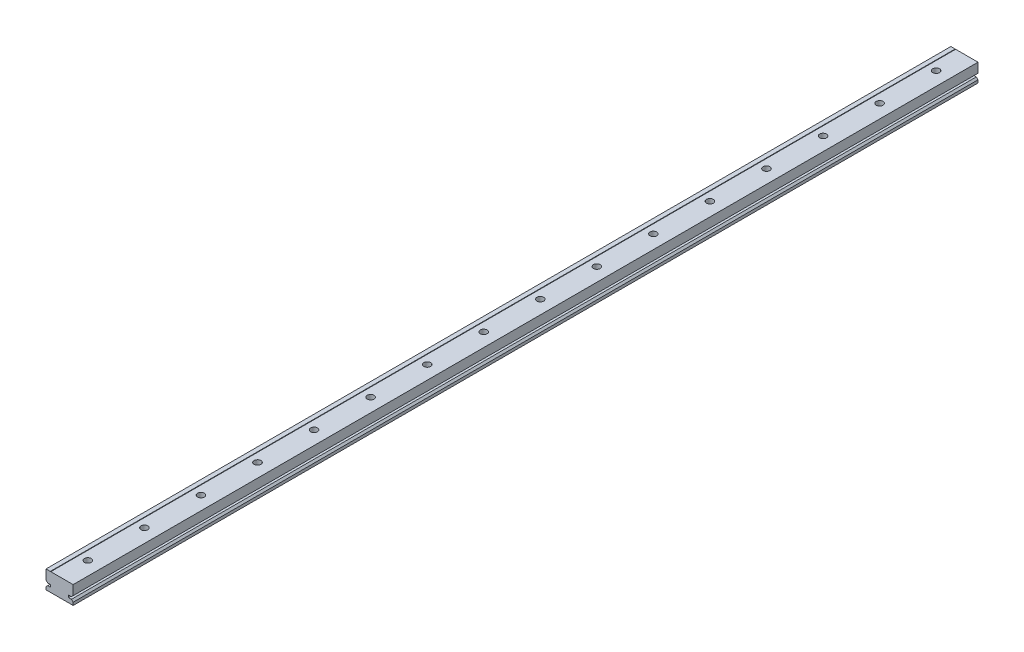
ISO-10303-21;
HEADER;
FILE_DESCRIPTION(('STEP AP214'),'2;1');
FILE_NAME('part.step','',(''),(''),'','','');
FILE_SCHEMA(('AUTOMOTIVE_DESIGN { 1 0 10303 214 1 1 1 1 }'));
ENDSEC;
DATA;
#1=APPLICATION_CONTEXT('core data for automotive mechanical design processes');
#2=APPLICATION_PROTOCOL_DEFINITION('international standard','automotive_design',2000,#1);
#3=PRODUCT_CONTEXT('',#1,'mechanical');
#4=PRODUCT('Part','Part','',(#3));
#5=PRODUCT_RELATED_PRODUCT_CATEGORY('part','',(#4));
#6=PRODUCT_DEFINITION_FORMATION('','',#4);
#7=PRODUCT_DEFINITION_CONTEXT('part definition',#1,'design');
#8=PRODUCT_DEFINITION('design','',#6,#7);
#9=PRODUCT_DEFINITION_SHAPE('','',#8);
#10=(LENGTH_UNIT() NAMED_UNIT(*) SI_UNIT(.MILLI.,.METRE.));
#11=(NAMED_UNIT(*) PLANE_ANGLE_UNIT() SI_UNIT($,.RADIAN.));
#12=(NAMED_UNIT(*) SI_UNIT($,.STERADIAN.) SOLID_ANGLE_UNIT());
#13=UNCERTAINTY_MEASURE_WITH_UNIT(LENGTH_MEASURE(1.E-05),#10,'distance_accuracy_value','');
#14=(GEOMETRIC_REPRESENTATION_CONTEXT(3) GLOBAL_UNCERTAINTY_ASSIGNED_CONTEXT((#13)) GLOBAL_UNIT_ASSIGNED_CONTEXT((#10,
#11,#12)) REPRESENTATION_CONTEXT('',''));
#15=CARTESIAN_POINT('',(0.,0.,0.));
#16=DIRECTION('',(0.,0.,1.));
#17=DIRECTION('',(1.,0.,0.));
#18=AXIS2_PLACEMENT_3D('',#15,#16,#17);
#19=CARTESIAN_POINT('',(0.,6.,387.5));
#20=DIRECTION('',(0.,-1.,0.));
#21=DIRECTION('',(0.,0.,-1.));
#22=AXIS2_PLACEMENT_3D('',#19,#20,#21);
#23=CYLINDRICAL_SURFACE('',#22,1.5);
#24=CARTESIAN_POINT('',(0.,-4.,387.5));
#25=DIRECTION('',(0.,-1.,0.));
#26=DIRECTION('',(0.,0.,-1.));
#27=AXIS2_PLACEMENT_3D('',#24,#25,#26);
#28=CIRCLE('',#27,1.5);
#29=CARTESIAN_POINT('',(0.,-4.,386.));
#30=VERTEX_POINT('',#29);
#31=EDGE_CURVE('E40',#30,#30,#28,.T.);
#32=ORIENTED_EDGE('',*,*,#31,.T.);
#33=EDGE_LOOP('',(#32));
#34=FACE_BOUND('',#33,.T.);
#35=CARTESIAN_POINT('',(0.,4.,387.5));
#36=DIRECTION('',(0.,-1.,0.));
#37=DIRECTION('',(1.,0.,0.));
#38=AXIS2_PLACEMENT_3D('',#35,#36,#37);
#39=CIRCLE('',#38,1.5);
#40=CARTESIAN_POINT('',(1.5,4.,387.5));
#41=VERTEX_POINT('',#40);
#42=EDGE_CURVE('E11',#41,#41,#39,.T.);
#43=ORIENTED_EDGE('',*,*,#42,.F.);
#44=EDGE_LOOP('',(#43));
#45=FACE_BOUND('',#44,.T.);
#46=ADVANCED_FACE('F32',(#34,#45),#23,.F.);
#47=CARTESIAN_POINT('',(0.,6.,362.5));
#48=DIRECTION('',(0.,-1.,0.));
#49=DIRECTION('',(0.,0.,-1.));
#50=AXIS2_PLACEMENT_3D('',#47,#48,#49);
#51=CYLINDRICAL_SURFACE('',#50,1.5);
#52=CARTESIAN_POINT('',(0.,-4.,362.5));
#53=DIRECTION('',(0.,-1.,0.));
#54=DIRECTION('',(0.,0.,-1.));
#55=AXIS2_PLACEMENT_3D('',#52,#53,#54);
#56=CIRCLE('',#55,1.5);
#57=CARTESIAN_POINT('',(0.,-4.,361.));
#58=VERTEX_POINT('',#57);
#59=EDGE_CURVE('E352',#58,#58,#56,.T.);
#60=ORIENTED_EDGE('',*,*,#59,.T.);
#61=EDGE_LOOP('',(#60));
#62=FACE_BOUND('',#61,.T.);
#63=CARTESIAN_POINT('',(0.,4.,362.5));
#64=DIRECTION('',(0.,-1.,0.));
#65=DIRECTION('',(1.,0.,0.));
#66=AXIS2_PLACEMENT_3D('',#63,#64,#65);
#67=CIRCLE('',#66,1.5);
#68=CARTESIAN_POINT('',(1.5,4.,362.5));
#69=VERTEX_POINT('',#68);
#70=EDGE_CURVE('E355',#69,#69,#67,.T.);
#71=ORIENTED_EDGE('',*,*,#70,.F.);
#72=EDGE_LOOP('',(#71));
#73=FACE_BOUND('',#72,.T.);
#74=ADVANCED_FACE('F377',(#62,#73),#51,.F.);
#75=CARTESIAN_POINT('',(0.,6.,337.5));
#76=DIRECTION('',(0.,-1.,0.));
#77=DIRECTION('',(0.,0.,-1.));
#78=AXIS2_PLACEMENT_3D('',#75,#76,#77);
#79=CYLINDRICAL_SURFACE('',#78,1.5);
#80=CARTESIAN_POINT('',(0.,-4.,337.5));
#81=DIRECTION('',(0.,-1.,0.));
#82=DIRECTION('',(0.,0.,-1.));
#83=AXIS2_PLACEMENT_3D('',#80,#81,#82);
#84=CIRCLE('',#83,1.5);
#85=CARTESIAN_POINT('',(0.,-4.,336.));
#86=VERTEX_POINT('',#85);
#87=EDGE_CURVE('E346',#86,#86,#84,.T.);
#88=ORIENTED_EDGE('',*,*,#87,.T.);
#89=EDGE_LOOP('',(#88));
#90=FACE_BOUND('',#89,.T.);
#91=CARTESIAN_POINT('',(0.,4.,337.5));
#92=DIRECTION('',(0.,-1.,0.));
#93=DIRECTION('',(1.,0.,0.));
#94=AXIS2_PLACEMENT_3D('',#91,#92,#93);
#95=CIRCLE('',#94,1.5);
#96=CARTESIAN_POINT('',(1.5,4.,337.5));
#97=VERTEX_POINT('',#96);
#98=EDGE_CURVE('E349',#97,#97,#95,.T.);
#99=ORIENTED_EDGE('',*,*,#98,.F.);
#100=EDGE_LOOP('',(#99));
#101=FACE_BOUND('',#100,.T.);
#102=ADVANCED_FACE('F381',(#90,#101),#79,.F.);
#103=CARTESIAN_POINT('',(0.,6.,312.5));
#104=DIRECTION('',(0.,-1.,0.));
#105=DIRECTION('',(0.,0.,-1.));
#106=AXIS2_PLACEMENT_3D('',#103,#104,#105);
#107=CYLINDRICAL_SURFACE('',#106,1.5);
#108=CARTESIAN_POINT('',(0.,-4.,312.5));
#109=DIRECTION('',(0.,-1.,0.));
#110=DIRECTION('',(0.,0.,-1.));
#111=AXIS2_PLACEMENT_3D('',#108,#109,#110);
#112=CIRCLE('',#111,1.5);
#113=CARTESIAN_POINT('',(0.,-4.,311.));
#114=VERTEX_POINT('',#113);
#115=EDGE_CURVE('E340',#114,#114,#112,.T.);
#116=ORIENTED_EDGE('',*,*,#115,.T.);
#117=EDGE_LOOP('',(#116));
#118=FACE_BOUND('',#117,.T.);
#119=CARTESIAN_POINT('',(0.,4.,312.5));
#120=DIRECTION('',(0.,-1.,0.));
#121=DIRECTION('',(1.,0.,0.));
#122=AXIS2_PLACEMENT_3D('',#119,#120,#121);
#123=CIRCLE('',#122,1.5);
#124=CARTESIAN_POINT('',(1.5,4.,312.5));
#125=VERTEX_POINT('',#124);
#126=EDGE_CURVE('E343',#125,#125,#123,.T.);
#127=ORIENTED_EDGE('',*,*,#126,.F.);
#128=EDGE_LOOP('',(#127));
#129=FACE_BOUND('',#128,.T.);
#130=ADVANCED_FACE('F386',(#118,#129),#107,.F.);
#131=CARTESIAN_POINT('',(0.,6.,287.5));
#132=DIRECTION('',(0.,-1.,0.));
#133=DIRECTION('',(0.,0.,-1.));
#134=AXIS2_PLACEMENT_3D('',#131,#132,#133);
#135=CYLINDRICAL_SURFACE('',#134,1.5);
#136=CARTESIAN_POINT('',(0.,-4.,287.5));
#137=DIRECTION('',(0.,-1.,0.));
#138=DIRECTION('',(0.,0.,-1.));
#139=AXIS2_PLACEMENT_3D('',#136,#137,#138);
#140=CIRCLE('',#139,1.5);
#141=CARTESIAN_POINT('',(0.,-4.,286.));
#142=VERTEX_POINT('',#141);
#143=EDGE_CURVE('E334',#142,#142,#140,.T.);
#144=ORIENTED_EDGE('',*,*,#143,.T.);
#145=EDGE_LOOP('',(#144));
#146=FACE_BOUND('',#145,.T.);
#147=CARTESIAN_POINT('',(0.,4.,287.5));
#148=DIRECTION('',(0.,-1.,0.));
#149=DIRECTION('',(1.,0.,0.));
#150=AXIS2_PLACEMENT_3D('',#147,#148,#149);
#151=CIRCLE('',#150,1.5);
#152=CARTESIAN_POINT('',(1.5,4.,287.5));
#153=VERTEX_POINT('',#152);
#154=EDGE_CURVE('E337',#153,#153,#151,.T.);
#155=ORIENTED_EDGE('',*,*,#154,.F.);
#156=EDGE_LOOP('',(#155));
#157=FACE_BOUND('',#156,.T.);
#158=ADVANCED_FACE('F393',(#146,#157),#135,.F.);
#159=CARTESIAN_POINT('',(0.,6.,262.5));
#160=DIRECTION('',(0.,-1.,0.));
#161=DIRECTION('',(0.,0.,-1.));
#162=AXIS2_PLACEMENT_3D('',#159,#160,#161);
#163=CYLINDRICAL_SURFACE('',#162,1.5);
#164=CARTESIAN_POINT('',(0.,-4.,262.5));
#165=DIRECTION('',(0.,-1.,0.));
#166=DIRECTION('',(0.,0.,-1.));
#167=AXIS2_PLACEMENT_3D('',#164,#165,#166);
#168=CIRCLE('',#167,1.5);
#169=CARTESIAN_POINT('',(0.,-4.,261.));
#170=VERTEX_POINT('',#169);
#171=EDGE_CURVE('E328',#170,#170,#168,.T.);
#172=ORIENTED_EDGE('',*,*,#171,.T.);
#173=EDGE_LOOP('',(#172));
#174=FACE_BOUND('',#173,.T.);
#175=CARTESIAN_POINT('',(0.,4.,262.5));
#176=DIRECTION('',(0.,-1.,0.));
#177=DIRECTION('',(1.,0.,0.));
#178=AXIS2_PLACEMENT_3D('',#175,#176,#177);
#179=CIRCLE('',#178,1.5);
#180=CARTESIAN_POINT('',(1.5,4.,262.5));
#181=VERTEX_POINT('',#180);
#182=EDGE_CURVE('E331',#181,#181,#179,.T.);
#183=ORIENTED_EDGE('',*,*,#182,.F.);
#184=EDGE_LOOP('',(#183));
#185=FACE_BOUND('',#184,.T.);
#186=ADVANCED_FACE('F397',(#174,#185),#163,.F.);
#187=CARTESIAN_POINT('',(0.,6.,237.5));
#188=DIRECTION('',(0.,-1.,0.));
#189=DIRECTION('',(0.,0.,-1.));
#190=AXIS2_PLACEMENT_3D('',#187,#188,#189);
#191=CYLINDRICAL_SURFACE('',#190,1.5);
#192=CARTESIAN_POINT('',(0.,-4.,237.5));
#193=DIRECTION('',(0.,-1.,0.));
#194=DIRECTION('',(0.,0.,-1.));
#195=AXIS2_PLACEMENT_3D('',#192,#193,#194);
#196=CIRCLE('',#195,1.5);
#197=CARTESIAN_POINT('',(0.,-4.,236.));
#198=VERTEX_POINT('',#197);
#199=EDGE_CURVE('E322',#198,#198,#196,.T.);
#200=ORIENTED_EDGE('',*,*,#199,.T.);
#201=EDGE_LOOP('',(#200));
#202=FACE_BOUND('',#201,.T.);
#203=CARTESIAN_POINT('',(0.,4.,237.5));
#204=DIRECTION('',(0.,-1.,0.));
#205=DIRECTION('',(1.,0.,0.));
#206=AXIS2_PLACEMENT_3D('',#203,#204,#205);
#207=CIRCLE('',#206,1.5);
#208=CARTESIAN_POINT('',(1.5,4.,237.5));
#209=VERTEX_POINT('',#208);
#210=EDGE_CURVE('E325',#209,#209,#207,.T.);
#211=ORIENTED_EDGE('',*,*,#210,.F.);
#212=EDGE_LOOP('',(#211));
#213=FACE_BOUND('',#212,.T.);
#214=ADVANCED_FACE('F401',(#202,#213),#191,.F.);
#215=CARTESIAN_POINT('',(0.,6.,212.5));
#216=DIRECTION('',(0.,-1.,0.));
#217=DIRECTION('',(0.,0.,-1.));
#218=AXIS2_PLACEMENT_3D('',#215,#216,#217);
#219=CYLINDRICAL_SURFACE('',#218,1.5);
#220=CARTESIAN_POINT('',(0.,-4.,212.5));
#221=DIRECTION('',(0.,-1.,0.));
#222=DIRECTION('',(0.,0.,-1.));
#223=AXIS2_PLACEMENT_3D('',#220,#221,#222);
#224=CIRCLE('',#223,1.5);
#225=CARTESIAN_POINT('',(0.,-4.,211.));
#226=VERTEX_POINT('',#225);
#227=EDGE_CURVE('E316',#226,#226,#224,.T.);
#228=ORIENTED_EDGE('',*,*,#227,.T.);
#229=EDGE_LOOP('',(#228));
#230=FACE_BOUND('',#229,.T.);
#231=CARTESIAN_POINT('',(0.,4.,212.5));
#232=DIRECTION('',(0.,-1.,0.));
#233=DIRECTION('',(1.,0.,0.));
#234=AXIS2_PLACEMENT_3D('',#231,#232,#233);
#235=CIRCLE('',#234,1.5);
#236=CARTESIAN_POINT('',(1.5,4.,212.5));
#237=VERTEX_POINT('',#236);
#238=EDGE_CURVE('E319',#237,#237,#235,.T.);
#239=ORIENTED_EDGE('',*,*,#238,.F.);
#240=EDGE_LOOP('',(#239));
#241=FACE_BOUND('',#240,.T.);
#242=ADVANCED_FACE('F405',(#230,#241),#219,.F.);
#243=CARTESIAN_POINT('',(0.,6.,187.5));
#244=DIRECTION('',(0.,-1.,0.));
#245=DIRECTION('',(0.,0.,-1.));
#246=AXIS2_PLACEMENT_3D('',#243,#244,#245);
#247=CYLINDRICAL_SURFACE('',#246,1.5);
#248=CARTESIAN_POINT('',(0.,-4.,187.5));
#249=DIRECTION('',(0.,-1.,0.));
#250=DIRECTION('',(0.,0.,-1.));
#251=AXIS2_PLACEMENT_3D('',#248,#249,#250);
#252=CIRCLE('',#251,1.5);
#253=CARTESIAN_POINT('',(0.,-4.,186.));
#254=VERTEX_POINT('',#253);
#255=EDGE_CURVE('E310',#254,#254,#252,.T.);
#256=ORIENTED_EDGE('',*,*,#255,.T.);
#257=EDGE_LOOP('',(#256));
#258=FACE_BOUND('',#257,.T.);
#259=CARTESIAN_POINT('',(0.,4.,187.5));
#260=DIRECTION('',(0.,-1.,0.));
#261=DIRECTION('',(1.,0.,0.));
#262=AXIS2_PLACEMENT_3D('',#259,#260,#261);
#263=CIRCLE('',#262,1.5);
#264=CARTESIAN_POINT('',(1.5,4.,187.5));
#265=VERTEX_POINT('',#264);
#266=EDGE_CURVE('E313',#265,#265,#263,.T.);
#267=ORIENTED_EDGE('',*,*,#266,.F.);
#268=EDGE_LOOP('',(#267));
#269=FACE_BOUND('',#268,.T.);
#270=ADVANCED_FACE('F409',(#258,#269),#247,.F.);
#271=CARTESIAN_POINT('',(0.,6.,162.5));
#272=DIRECTION('',(0.,-1.,0.));
#273=DIRECTION('',(0.,0.,-1.));
#274=AXIS2_PLACEMENT_3D('',#271,#272,#273);
#275=CYLINDRICAL_SURFACE('',#274,1.5);
#276=CARTESIAN_POINT('',(0.,-4.,162.5));
#277=DIRECTION('',(0.,-1.,0.));
#278=DIRECTION('',(0.,0.,-1.));
#279=AXIS2_PLACEMENT_3D('',#276,#277,#278);
#280=CIRCLE('',#279,1.5);
#281=CARTESIAN_POINT('',(0.,-4.,161.));
#282=VERTEX_POINT('',#281);
#283=EDGE_CURVE('E304',#282,#282,#280,.T.);
#284=ORIENTED_EDGE('',*,*,#283,.T.);
#285=EDGE_LOOP('',(#284));
#286=FACE_BOUND('',#285,.T.);
#287=CARTESIAN_POINT('',(0.,4.,162.5));
#288=DIRECTION('',(0.,-1.,0.));
#289=DIRECTION('',(1.,0.,0.));
#290=AXIS2_PLACEMENT_3D('',#287,#288,#289);
#291=CIRCLE('',#290,1.5);
#292=CARTESIAN_POINT('',(1.5,4.,162.5));
#293=VERTEX_POINT('',#292);
#294=EDGE_CURVE('E307',#293,#293,#291,.T.);
#295=ORIENTED_EDGE('',*,*,#294,.F.);
#296=EDGE_LOOP('',(#295));
#297=FACE_BOUND('',#296,.T.);
#298=ADVANCED_FACE('F413',(#286,#297),#275,.F.);
#299=CARTESIAN_POINT('',(0.,6.,137.5));
#300=DIRECTION('',(0.,-1.,0.));
#301=DIRECTION('',(0.,0.,-1.));
#302=AXIS2_PLACEMENT_3D('',#299,#300,#301);
#303=CYLINDRICAL_SURFACE('',#302,1.5);
#304=CARTESIAN_POINT('',(0.,-4.,137.5));
#305=DIRECTION('',(0.,-1.,0.));
#306=DIRECTION('',(0.,0.,-1.));
#307=AXIS2_PLACEMENT_3D('',#304,#305,#306);
#308=CIRCLE('',#307,1.5);
#309=CARTESIAN_POINT('',(0.,-4.,136.));
#310=VERTEX_POINT('',#309);
#311=EDGE_CURVE('E298',#310,#310,#308,.T.);
#312=ORIENTED_EDGE('',*,*,#311,.T.);
#313=EDGE_LOOP('',(#312));
#314=FACE_BOUND('',#313,.T.);
#315=CARTESIAN_POINT('',(0.,4.,137.5));
#316=DIRECTION('',(0.,-1.,0.));
#317=DIRECTION('',(1.,0.,0.));
#318=AXIS2_PLACEMENT_3D('',#315,#316,#317);
#319=CIRCLE('',#318,1.5);
#320=CARTESIAN_POINT('',(1.5,4.,137.5));
#321=VERTEX_POINT('',#320);
#322=EDGE_CURVE('E301',#321,#321,#319,.T.);
#323=ORIENTED_EDGE('',*,*,#322,.F.);
#324=EDGE_LOOP('',(#323));
#325=FACE_BOUND('',#324,.T.);
#326=ADVANCED_FACE('F417',(#314,#325),#303,.F.);
#327=CARTESIAN_POINT('',(0.,6.,112.5));
#328=DIRECTION('',(0.,-1.,0.));
#329=DIRECTION('',(0.,0.,-1.));
#330=AXIS2_PLACEMENT_3D('',#327,#328,#329);
#331=CYLINDRICAL_SURFACE('',#330,1.5);
#332=CARTESIAN_POINT('',(0.,-4.,112.5));
#333=DIRECTION('',(0.,-1.,0.));
#334=DIRECTION('',(0.,0.,-1.));
#335=AXIS2_PLACEMENT_3D('',#332,#333,#334);
#336=CIRCLE('',#335,1.5);
#337=CARTESIAN_POINT('',(0.,-4.,111.));
#338=VERTEX_POINT('',#337);
#339=EDGE_CURVE('E292',#338,#338,#336,.T.);
#340=ORIENTED_EDGE('',*,*,#339,.T.);
#341=EDGE_LOOP('',(#340));
#342=FACE_BOUND('',#341,.T.);
#343=CARTESIAN_POINT('',(0.,4.,112.5));
#344=DIRECTION('',(0.,-1.,0.));
#345=DIRECTION('',(1.,0.,0.));
#346=AXIS2_PLACEMENT_3D('',#343,#344,#345);
#347=CIRCLE('',#346,1.5);
#348=CARTESIAN_POINT('',(1.5,4.,112.5));
#349=VERTEX_POINT('',#348);
#350=EDGE_CURVE('E295',#349,#349,#347,.T.);
#351=ORIENTED_EDGE('',*,*,#350,.F.);
#352=EDGE_LOOP('',(#351));
#353=FACE_BOUND('',#352,.T.);
#354=ADVANCED_FACE('F421',(#342,#353),#331,.F.);
#355=CARTESIAN_POINT('',(0.,6.,87.5));
#356=DIRECTION('',(0.,-1.,0.));
#357=DIRECTION('',(0.,0.,-1.));
#358=AXIS2_PLACEMENT_3D('',#355,#356,#357);
#359=CYLINDRICAL_SURFACE('',#358,1.5);
#360=CARTESIAN_POINT('',(0.,-4.,87.5));
#361=DIRECTION('',(0.,-1.,0.));
#362=DIRECTION('',(0.,0.,-1.));
#363=AXIS2_PLACEMENT_3D('',#360,#361,#362);
#364=CIRCLE('',#363,1.5);
#365=CARTESIAN_POINT('',(0.,-4.,86.));
#366=VERTEX_POINT('',#365);
#367=EDGE_CURVE('E286',#366,#366,#364,.T.);
#368=ORIENTED_EDGE('',*,*,#367,.T.);
#369=EDGE_LOOP('',(#368));
#370=FACE_BOUND('',#369,.T.);
#371=CARTESIAN_POINT('',(0.,4.,87.5));
#372=DIRECTION('',(0.,-1.,0.));
#373=DIRECTION('',(1.,0.,0.));
#374=AXIS2_PLACEMENT_3D('',#371,#372,#373);
#375=CIRCLE('',#374,1.5);
#376=CARTESIAN_POINT('',(1.5,4.,87.5));
#377=VERTEX_POINT('',#376);
#378=EDGE_CURVE('E289',#377,#377,#375,.T.);
#379=ORIENTED_EDGE('',*,*,#378,.F.);
#380=EDGE_LOOP('',(#379));
#381=FACE_BOUND('',#380,.T.);
#382=ADVANCED_FACE('F425',(#370,#381),#359,.F.);
#383=CARTESIAN_POINT('',(0.,6.,62.5));
#384=DIRECTION('',(0.,-1.,0.));
#385=DIRECTION('',(0.,0.,-1.));
#386=AXIS2_PLACEMENT_3D('',#383,#384,#385);
#387=CYLINDRICAL_SURFACE('',#386,1.5);
#388=CARTESIAN_POINT('',(0.,-4.,62.5));
#389=DIRECTION('',(0.,-1.,0.));
#390=DIRECTION('',(0.,0.,-1.));
#391=AXIS2_PLACEMENT_3D('',#388,#389,#390);
#392=CIRCLE('',#391,1.5);
#393=CARTESIAN_POINT('',(0.,-4.,61.));
#394=VERTEX_POINT('',#393);
#395=EDGE_CURVE('E280',#394,#394,#392,.T.);
#396=ORIENTED_EDGE('',*,*,#395,.T.);
#397=EDGE_LOOP('',(#396));
#398=FACE_BOUND('',#397,.T.);
#399=CARTESIAN_POINT('',(0.,4.,62.5));
#400=DIRECTION('',(0.,-1.,0.));
#401=DIRECTION('',(1.,0.,0.));
#402=AXIS2_PLACEMENT_3D('',#399,#400,#401);
#403=CIRCLE('',#402,1.5);
#404=CARTESIAN_POINT('',(1.5,4.,62.5));
#405=VERTEX_POINT('',#404);
#406=EDGE_CURVE('E283',#405,#405,#403,.T.);
#407=ORIENTED_EDGE('',*,*,#406,.F.);
#408=EDGE_LOOP('',(#407));
#409=FACE_BOUND('',#408,.T.);
#410=ADVANCED_FACE('F429',(#398,#409),#387,.F.);
#411=CARTESIAN_POINT('',(6.,-2.75,400.));
#412=DIRECTION('',(-1.,0.,0.));
#413=DIRECTION('',(0.,-1.,0.));
#414=AXIS2_PLACEMENT_3D('',#411,#412,#413);
#415=PLANE('',#414);
#416=DIRECTION('',(0.,1.,0.));
#417=VECTOR('',#416,1.);
#418=CARTESIAN_POINT('',(6.,-2.75,0.));
#419=LINE('',#418,#417);
#420=CARTESIAN_POINT('',(6.,-4.,0.));
#421=VERTEX_POINT('',#420);
#422=CARTESIAN_POINT('',(6.,-2.75,0.));
#423=VERTEX_POINT('',#422);
#424=EDGE_CURVE('E195',#421,#423,#419,.T.);
#425=ORIENTED_EDGE('',*,*,#424,.T.);
#426=DIRECTION('',(0.,0.,-1.));
#427=VECTOR('',#426,1.);
#428=CARTESIAN_POINT('',(6.,-2.75,400.));
#429=LINE('',#428,#427);
#430=CARTESIAN_POINT('',(6.,-2.75,400.));
#431=VERTEX_POINT('',#430);
#432=EDGE_CURVE('E278',#431,#423,#429,.T.);
#433=ORIENTED_EDGE('',*,*,#432,.F.);
#434=DIRECTION('',(0.,1.,0.));
#435=VECTOR('',#434,1.);
#436=CARTESIAN_POINT('',(6.,-2.75,400.));
#437=LINE('',#436,#435);
#438=CARTESIAN_POINT('',(6.,-4.,400.));
#439=VERTEX_POINT('',#438);
#440=EDGE_CURVE('E232',#439,#431,#437,.T.);
#441=ORIENTED_EDGE('',*,*,#440,.F.);
#442=DIRECTION('',(0.,0.,-1.));
#443=VECTOR('',#442,1.);
#444=CARTESIAN_POINT('',(6.,-4.,400.));
#445=LINE('',#444,#443);
#446=EDGE_CURVE('E191',#439,#421,#445,.T.);
#447=ORIENTED_EDGE('',*,*,#446,.T.);
#448=EDGE_LOOP('',(#425,#433,#441,#447));
#449=FACE_BOUND('',#448,.T.);
#450=ADVANCED_FACE('F433',(#449),#415,.F.);
#451=CARTESIAN_POINT('',(5.25,-2.,400.));
#452=DIRECTION('',(-0.707106781186547,-0.707106781186548,0.));
#453=DIRECTION('',(0.707106781186548,-0.707106781186547,0.));
#454=AXIS2_PLACEMENT_3D('',#451,#452,#453);
#455=PLANE('',#454);
#456=DIRECTION('',(-0.707106781186548,0.707106781186547,0.));
#457=VECTOR('',#456,1.);
#458=CARTESIAN_POINT('',(5.25,-2.,0.));
#459=LINE('',#458,#457);
#460=CARTESIAN_POINT('',(5.25,-2.,0.));
#461=VERTEX_POINT('',#460);
#462=EDGE_CURVE('E198',#423,#461,#459,.T.);
#463=ORIENTED_EDGE('',*,*,#462,.T.);
#464=DIRECTION('',(0.,0.,-1.));
#465=VECTOR('',#464,1.);
#466=CARTESIAN_POINT('',(5.25,-2.,400.));
#467=LINE('',#466,#465);
#468=CARTESIAN_POINT('',(5.25,-2.,400.));
#469=VERTEX_POINT('',#468);
#470=EDGE_CURVE('E275',#469,#461,#467,.T.);
#471=ORIENTED_EDGE('',*,*,#470,.F.);
#472=DIRECTION('',(-0.707106781186548,0.707106781186547,0.));
#473=VECTOR('',#472,1.);
#474=CARTESIAN_POINT('',(5.25,-2.,400.));
#475=LINE('',#474,#473);
#476=EDGE_CURVE('E125',#431,#469,#475,.T.);
#477=ORIENTED_EDGE('',*,*,#476,.F.);
#478=ORIENTED_EDGE('',*,*,#432,.T.);
#479=EDGE_LOOP('',(#463,#471,#477,#478));
#480=FACE_BOUND('',#479,.T.);
#481=ADVANCED_FACE('F437',(#480),#455,.F.);
#482=CARTESIAN_POINT('',(5.25,-2.,400.));
#483=DIRECTION('',(0.,-1.,0.));
#484=DIRECTION('',(0.,0.,-1.));
#485=AXIS2_PLACEMENT_3D('',#482,#483,#484);
#486=PLANE('',#485);
#487=DIRECTION('',(-1.,0.,0.));
#488=VECTOR('',#487,1.);
#489=CARTESIAN_POINT('',(5.25,-2.,0.));
#490=LINE('',#489,#488);
#491=CARTESIAN_POINT('',(4.,-2.,0.));
#492=VERTEX_POINT('',#491);
#493=EDGE_CURVE('E201',#461,#492,#490,.T.);
#494=ORIENTED_EDGE('',*,*,#493,.T.);
#495=DIRECTION('',(0.,0.,-1.));
#496=VECTOR('',#495,1.);
#497=CARTESIAN_POINT('',(4.,-2.,400.));
#498=LINE('',#497,#496);
#499=CARTESIAN_POINT('',(4.,-2.,400.));
#500=VERTEX_POINT('',#499);
#501=EDGE_CURVE('E272',#500,#492,#498,.T.);
#502=ORIENTED_EDGE('',*,*,#501,.F.);
#503=DIRECTION('',(-1.,0.,0.));
#504=VECTOR('',#503,1.);
#505=CARTESIAN_POINT('',(5.25,-2.,400.));
#506=LINE('',#505,#504);
#507=EDGE_CURVE('E652',#469,#500,#506,.T.);
#508=ORIENTED_EDGE('',*,*,#507,.F.);
#509=ORIENTED_EDGE('',*,*,#470,.T.);
#510=EDGE_LOOP('',(#494,#502,#508,#509));
#511=FACE_BOUND('',#510,.T.);
#512=ADVANCED_FACE('F441',(#511),#486,.F.);
#513=CARTESIAN_POINT('',(4.,-2.,400.));
#514=DIRECTION('',(-1.,0.,0.));
#515=DIRECTION('',(0.,0.,1.));
#516=AXIS2_PLACEMENT_3D('',#513,#514,#515);
#517=PLANE('',#516);
#518=DIRECTION('',(0.,1.,0.));
#519=VECTOR('',#518,1.);
#520=CARTESIAN_POINT('',(4.,-2.,0.));
#521=LINE('',#520,#519);
#522=CARTESIAN_POINT('',(4.,-1.,0.));
#523=VERTEX_POINT('',#522);
#524=EDGE_CURVE('E203',#492,#523,#521,.T.);
#525=ORIENTED_EDGE('',*,*,#524,.T.);
#526=DIRECTION('',(0.,0.,-1.));
#527=VECTOR('',#526,1.);
#528=CARTESIAN_POINT('',(4.,-1.,400.));
#529=LINE('',#528,#527);
#530=CARTESIAN_POINT('',(4.,-1.,400.));
#531=VERTEX_POINT('',#530);
#532=EDGE_CURVE('E269',#531,#523,#529,.T.);
#533=ORIENTED_EDGE('',*,*,#532,.F.);
#534=DIRECTION('',(0.,1.,0.));
#535=VECTOR('',#534,1.);
#536=CARTESIAN_POINT('',(4.,-2.,400.));
#537=LINE('',#536,#535);
#538=EDGE_CURVE('E654',#500,#531,#537,.T.);
#539=ORIENTED_EDGE('',*,*,#538,.F.);
#540=ORIENTED_EDGE('',*,*,#501,.T.);
#541=EDGE_LOOP('',(#525,#533,#539,#540));
#542=FACE_BOUND('',#541,.T.);
#543=ADVANCED_FACE('F444',(#542),#517,.F.);
#544=CARTESIAN_POINT('',(5.25,-1.,400.));
#545=DIRECTION('',(0.,1.,0.));
#546=DIRECTION('',(0.,0.,1.));
#547=AXIS2_PLACEMENT_3D('',#544,#545,#546);
#548=PLANE('',#547);
#549=DIRECTION('',(1.,0.,0.));
#550=VECTOR('',#549,1.);
#551=CARTESIAN_POINT('',(5.25,-1.,0.));
#552=LINE('',#551,#550);
#553=CARTESIAN_POINT('',(5.25,-1.,0.));
#554=VERTEX_POINT('',#553);
#555=EDGE_CURVE('E205',#523,#554,#552,.T.);
#556=ORIENTED_EDGE('',*,*,#555,.T.);
#557=DIRECTION('',(0.,0.,-1.));
#558=VECTOR('',#557,1.);
#559=CARTESIAN_POINT('',(5.25,-1.,400.));
#560=LINE('',#559,#558);
#561=CARTESIAN_POINT('',(5.25,-1.,400.));
#562=VERTEX_POINT('',#561);
#563=EDGE_CURVE('E266',#562,#554,#560,.T.);
#564=ORIENTED_EDGE('',*,*,#563,.F.);
#565=DIRECTION('',(1.,0.,0.));
#566=VECTOR('',#565,1.);
#567=CARTESIAN_POINT('',(5.25,-1.,400.));
#568=LINE('',#567,#566);
#569=EDGE_CURVE('E656',#531,#562,#568,.T.);
#570=ORIENTED_EDGE('',*,*,#569,.F.);
#571=ORIENTED_EDGE('',*,*,#532,.T.);
#572=EDGE_LOOP('',(#556,#564,#570,#571));
#573=FACE_BOUND('',#572,.T.);
#574=ADVANCED_FACE('F448',(#573),#548,.F.);
#575=CARTESIAN_POINT('',(5.25,-1.,400.));
#576=DIRECTION('',(-0.707106781186548,0.707106781186547,0.));
#577=DIRECTION('',(-0.707106781186547,-0.707106781186548,0.));
#578=AXIS2_PLACEMENT_3D('',#575,#576,#577);
#579=PLANE('',#578);
#580=DIRECTION('',(0.707106781186547,0.707106781186548,0.));
#581=VECTOR('',#580,1.);
#582=CARTESIAN_POINT('',(5.25,-1.,0.));
#583=LINE('',#582,#581);
#584=CARTESIAN_POINT('',(6.,-0.250000000000001,0.));
#585=VERTEX_POINT('',#584);
#586=EDGE_CURVE('E207',#554,#585,#583,.T.);
#587=ORIENTED_EDGE('',*,*,#586,.T.);
#588=DIRECTION('',(0.,0.,-1.));
#589=VECTOR('',#588,1.);
#590=CARTESIAN_POINT('',(6.,-0.250000000000001,400.));
#591=LINE('',#590,#589);
#592=CARTESIAN_POINT('',(6.,-0.250000000000001,400.));
#593=VERTEX_POINT('',#592);
#594=EDGE_CURVE('E263',#593,#585,#591,.T.);
#595=ORIENTED_EDGE('',*,*,#594,.F.);
#596=DIRECTION('',(0.707106781186547,0.707106781186548,0.));
#597=VECTOR('',#596,1.);
#598=CARTESIAN_POINT('',(5.25,-1.,400.));
#599=LINE('',#598,#597);
#600=EDGE_CURVE('E658',#562,#593,#599,.T.);
#601=ORIENTED_EDGE('',*,*,#600,.F.);
#602=ORIENTED_EDGE('',*,*,#563,.T.);
#603=EDGE_LOOP('',(#587,#595,#601,#602));
#604=FACE_BOUND('',#603,.T.);
#605=ADVANCED_FACE('F452',(#604),#579,.F.);
#606=CARTESIAN_POINT('',(6.,4.,400.));
#607=DIRECTION('',(-1.,0.,0.));
#608=DIRECTION('',(0.,-1.,0.));
#609=AXIS2_PLACEMENT_3D('',#606,#607,#608);
#610=PLANE('',#609);
#611=DIRECTION('',(0.,1.,0.));
#612=VECTOR('',#611,1.);
#613=CARTESIAN_POINT('',(6.,4.,0.));
#614=LINE('',#613,#612);
#615=CARTESIAN_POINT('',(6.,4.,0.));
#616=VERTEX_POINT('',#615);
#617=EDGE_CURVE('E209',#585,#616,#614,.T.);
#618=ORIENTED_EDGE('',*,*,#617,.T.);
#619=DIRECTION('',(0.,0.,-1.));
#620=VECTOR('',#619,1.);
#621=CARTESIAN_POINT('',(6.,4.,400.));
#622=LINE('',#621,#620);
#623=CARTESIAN_POINT('',(6.,4.,400.));
#624=VERTEX_POINT('',#623);
#625=EDGE_CURVE('E260',#624,#616,#622,.T.);
#626=ORIENTED_EDGE('',*,*,#625,.F.);
#627=DIRECTION('',(0.,1.,0.));
#628=VECTOR('',#627,1.);
#629=CARTESIAN_POINT('',(6.,4.,400.));
#630=LINE('',#629,#628);
#631=EDGE_CURVE('E660',#593,#624,#630,.T.);
#632=ORIENTED_EDGE('',*,*,#631,.F.);
#633=ORIENTED_EDGE('',*,*,#594,.T.);
#634=EDGE_LOOP('',(#618,#626,#632,#633));
#635=FACE_BOUND('',#634,.T.);
#636=ADVANCED_FACE('F456',(#635),#610,.F.);
#637=CARTESIAN_POINT('',(-3.88819660112501,4.,400.));
#638=DIRECTION('',(0.,-1.,0.));
#639=DIRECTION('',(1.,0.,0.));
#640=AXIS2_PLACEMENT_3D('',#637,#638,#639);
#641=PLANE('',#640);
#642=CARTESIAN_POINT('',(0.,4.,37.5));
#643=DIRECTION('',(0.,-1.,0.));
#644=DIRECTION('',(1.,0.,0.));
#645=AXIS2_PLACEMENT_3D('',#642,#643,#644);
#646=CIRCLE('',#645,1.5);
#647=CARTESIAN_POINT('',(1.5,4.,37.5));
#648=VERTEX_POINT('',#647);
#649=EDGE_CURVE('E641',#648,#648,#646,.T.);
#650=ORIENTED_EDGE('',*,*,#649,.T.);
#651=EDGE_LOOP('',(#650));
#652=FACE_BOUND('',#651,.T.);
#653=CARTESIAN_POINT('',(0.,4.,12.5));
#654=DIRECTION('',(0.,-1.,0.));
#655=DIRECTION('',(1.,0.,0.));
#656=AXIS2_PLACEMENT_3D('',#653,#654,#655);
#657=CIRCLE('',#656,1.5);
#658=CARTESIAN_POINT('',(1.5,4.,12.5));
#659=VERTEX_POINT('',#658);
#660=EDGE_CURVE('E199',#659,#659,#657,.T.);
#661=ORIENTED_EDGE('',*,*,#660,.T.);
#662=EDGE_LOOP('',(#661));
#663=FACE_BOUND('',#662,.T.);
#664=DIRECTION('',(-1.,0.,0.));
#665=VECTOR('',#664,1.);
#666=CARTESIAN_POINT('',(-3.88819660112501,4.,0.));
#667=LINE('',#666,#665);
#668=CARTESIAN_POINT('',(-3.88819660112501,4.,0.));
#669=VERTEX_POINT('',#668);
#670=EDGE_CURVE('E211',#616,#669,#667,.T.);
#671=ORIENTED_EDGE('',*,*,#670,.T.);
#672=DIRECTION('',(0.,0.,-1.));
#673=VECTOR('',#672,1.);
#674=CARTESIAN_POINT('',(-3.88819660112501,4.,400.));
#675=LINE('',#674,#673);
#676=CARTESIAN_POINT('',(-3.88819660112501,4.,400.));
#677=VERTEX_POINT('',#676);
#678=EDGE_CURVE('E257',#677,#669,#675,.T.);
#679=ORIENTED_EDGE('',*,*,#678,.F.);
#680=DIRECTION('',(-1.,0.,0.));
#681=VECTOR('',#680,1.);
#682=CARTESIAN_POINT('',(-3.88819660112501,4.,400.));
#683=LINE('',#682,#681);
#684=EDGE_CURVE('E662',#624,#677,#683,.T.);
#685=ORIENTED_EDGE('',*,*,#684,.F.);
#686=ORIENTED_EDGE('',*,*,#625,.T.);
#687=EDGE_LOOP('',(#671,#679,#685,#686));
#688=FACE_BOUND('',#687,.T.);
#689=ORIENTED_EDGE('',*,*,#406,.T.);
#690=EDGE_LOOP('',(#689));
#691=FACE_BOUND('',#690,.T.);
#692=ORIENTED_EDGE('',*,*,#378,.T.);
#693=EDGE_LOOP('',(#692));
#694=FACE_BOUND('',#693,.T.);
#695=ORIENTED_EDGE('',*,*,#350,.T.);
#696=EDGE_LOOP('',(#695));
#697=FACE_BOUND('',#696,.T.);
#698=ORIENTED_EDGE('',*,*,#322,.T.);
#699=EDGE_LOOP('',(#698));
#700=FACE_BOUND('',#699,.T.);
#701=ORIENTED_EDGE('',*,*,#294,.T.);
#702=EDGE_LOOP('',(#701));
#703=FACE_BOUND('',#702,.T.);
#704=ORIENTED_EDGE('',*,*,#266,.T.);
#705=EDGE_LOOP('',(#704));
#706=FACE_BOUND('',#705,.T.);
#707=ORIENTED_EDGE('',*,*,#238,.T.);
#708=EDGE_LOOP('',(#707));
#709=FACE_BOUND('',#708,.T.);
#710=ORIENTED_EDGE('',*,*,#210,.T.);
#711=EDGE_LOOP('',(#710));
#712=FACE_BOUND('',#711,.T.);
#713=ORIENTED_EDGE('',*,*,#182,.T.);
#714=EDGE_LOOP('',(#713));
#715=FACE_BOUND('',#714,.T.);
#716=ORIENTED_EDGE('',*,*,#154,.T.);
#717=EDGE_LOOP('',(#716));
#718=FACE_BOUND('',#717,.T.);
#719=ORIENTED_EDGE('',*,*,#126,.T.);
#720=EDGE_LOOP('',(#719));
#721=FACE_BOUND('',#720,.T.);
#722=ORIENTED_EDGE('',*,*,#98,.T.);
#723=EDGE_LOOP('',(#722));
#724=FACE_BOUND('',#723,.T.);
#725=ORIENTED_EDGE('',*,*,#70,.T.);
#726=EDGE_LOOP('',(#725));
#727=FACE_BOUND('',#726,.T.);
#728=ORIENTED_EDGE('',*,*,#42,.T.);
#729=EDGE_LOOP('',(#728));
#730=FACE_BOUND('',#729,.T.);
#731=ADVANCED_FACE('F460',(#652,#663,#688,#691,#694,#697,#700,#703,#706,#709,#712,#715,#718,
#721,#724,#727,#730),#641,.F.);
#732=CARTESIAN_POINT('',(-3.88819660112501,4.,400.));
#733=DIRECTION('',(0.666666666666666,-0.745355992499931,0.));
#734=DIRECTION('',(0.745355992499931,0.666666666666666,0.));
#735=AXIS2_PLACEMENT_3D('',#732,#733,#734);
#736=PLANE('',#735);
#737=DIRECTION('',(-0.745355992499931,-0.666666666666666,0.));
#738=VECTOR('',#737,1.);
#739=CARTESIAN_POINT('',(-3.88819660112501,4.,0.));
#740=LINE('',#739,#738);
#741=CARTESIAN_POINT('',(-4.,3.9,0.));
#742=VERTEX_POINT('',#741);
#743=EDGE_CURVE('E213',#669,#742,#740,.T.);
#744=ORIENTED_EDGE('',*,*,#743,.T.);
#745=DIRECTION('',(0.,0.,-1.));
#746=VECTOR('',#745,1.);
#747=CARTESIAN_POINT('',(-4.,3.9,400.));
#748=LINE('',#747,#746);
#749=CARTESIAN_POINT('',(-4.,3.9,400.));
#750=VERTEX_POINT('',#749);
#751=EDGE_CURVE('E254',#750,#742,#748,.T.);
#752=ORIENTED_EDGE('',*,*,#751,.F.);
#753=DIRECTION('',(-0.745355992499931,-0.666666666666666,0.));
#754=VECTOR('',#753,1.);
#755=CARTESIAN_POINT('',(-3.88819660112501,4.,400.));
#756=LINE('',#755,#754);
#757=EDGE_CURVE('E664',#677,#750,#756,.T.);
#758=ORIENTED_EDGE('',*,*,#757,.F.);
#759=ORIENTED_EDGE('',*,*,#678,.T.);
#760=EDGE_LOOP('',(#744,#752,#758,#759));
#761=FACE_BOUND('',#760,.T.);
#762=ADVANCED_FACE('F464',(#761),#736,.F.);
#763=CARTESIAN_POINT('',(-4.,3.9,400.));
#764=DIRECTION('',(-0.666666666666667,-0.74535599249993,0.));
#765=DIRECTION('',(0.74535599249993,-0.666666666666667,0.));
#766=AXIS2_PLACEMENT_3D('',#763,#764,#765);
#767=PLANE('',#766);
#768=DIRECTION('',(-0.74535599249993,0.666666666666667,0.));
#769=VECTOR('',#768,1.);
#770=CARTESIAN_POINT('',(-4.,3.9,0.));
#771=LINE('',#770,#769);
#772=CARTESIAN_POINT('',(-4.11180339887499,4.,0.));
#773=VERTEX_POINT('',#772);
#774=EDGE_CURVE('E215',#742,#773,#771,.T.);
#775=ORIENTED_EDGE('',*,*,#774,.T.);
#776=DIRECTION('',(0.,0.,-1.));
#777=VECTOR('',#776,1.);
#778=CARTESIAN_POINT('',(-4.11180339887499,4.,400.));
#779=LINE('',#778,#777);
#780=CARTESIAN_POINT('',(-4.11180339887499,4.,400.));
#781=VERTEX_POINT('',#780);
#782=EDGE_CURVE('E251',#781,#773,#779,.T.);
#783=ORIENTED_EDGE('',*,*,#782,.F.);
#784=DIRECTION('',(-0.74535599249993,0.666666666666667,0.));
#785=VECTOR('',#784,1.);
#786=CARTESIAN_POINT('',(-4.,3.9,400.));
#787=LINE('',#786,#785);
#788=EDGE_CURVE('E666',#750,#781,#787,.T.);
#789=ORIENTED_EDGE('',*,*,#788,.F.);
#790=ORIENTED_EDGE('',*,*,#751,.T.);
#791=EDGE_LOOP('',(#775,#783,#789,#790));
#792=FACE_BOUND('',#791,.T.);
#793=ADVANCED_FACE('F468',(#792),#767,.F.);
#794=CARTESIAN_POINT('',(-6.,4.,400.));
#795=DIRECTION('',(0.,-1.,0.));
#796=DIRECTION('',(1.,0.,0.));
#797=AXIS2_PLACEMENT_3D('',#794,#795,#796);
#798=PLANE('',#797);
#799=DIRECTION('',(-1.,0.,0.));
#800=VECTOR('',#799,1.);
#801=CARTESIAN_POINT('',(-6.,4.,0.));
#802=LINE('',#801,#800);
#803=CARTESIAN_POINT('',(-6.,4.,0.));
#804=VERTEX_POINT('',#803);
#805=EDGE_CURVE('E217',#773,#804,#802,.T.);
#806=ORIENTED_EDGE('',*,*,#805,.T.);
#807=DIRECTION('',(0.,0.,-1.));
#808=VECTOR('',#807,1.);
#809=CARTESIAN_POINT('',(-6.,4.,400.));
#810=LINE('',#809,#808);
#811=CARTESIAN_POINT('',(-6.,4.,400.));
#812=VERTEX_POINT('',#811);
#813=EDGE_CURVE('E248',#812,#804,#810,.T.);
#814=ORIENTED_EDGE('',*,*,#813,.F.);
#815=DIRECTION('',(-1.,0.,0.));
#816=VECTOR('',#815,1.);
#817=CARTESIAN_POINT('',(-6.,4.,400.));
#818=LINE('',#817,#816);
#819=EDGE_CURVE('E668',#781,#812,#818,.T.);
#820=ORIENTED_EDGE('',*,*,#819,.F.);
#821=ORIENTED_EDGE('',*,*,#782,.T.);
#822=EDGE_LOOP('',(#806,#814,#820,#821));
#823=FACE_BOUND('',#822,.T.);
#824=ADVANCED_FACE('F472',(#823),#798,.F.);
#825=CARTESIAN_POINT('',(-6.,4.,400.));
#826=DIRECTION('',(1.,0.,0.));
#827=DIRECTION('',(0.,1.,0.));
#828=AXIS2_PLACEMENT_3D('',#825,#826,#827);
#829=PLANE('',#828);
#830=DIRECTION('',(0.,-1.,0.));
#831=VECTOR('',#830,1.);
#832=CARTESIAN_POINT('',(-6.,4.,0.));
#833=LINE('',#832,#831);
#834=CARTESIAN_POINT('',(-6.,-0.250000000000001,0.));
#835=VERTEX_POINT('',#834);
#836=EDGE_CURVE('E219',#804,#835,#833,.T.);
#837=ORIENTED_EDGE('',*,*,#836,.T.);
#838=DIRECTION('',(0.,0.,-1.));
#839=VECTOR('',#838,1.);
#840=CARTESIAN_POINT('',(-6.,-0.250000000000001,400.));
#841=LINE('',#840,#839);
#842=CARTESIAN_POINT('',(-6.,-0.250000000000001,400.));
#843=VERTEX_POINT('',#842);
#844=EDGE_CURVE('E245',#843,#835,#841,.T.);
#845=ORIENTED_EDGE('',*,*,#844,.F.);
#846=DIRECTION('',(0.,-1.,0.));
#847=VECTOR('',#846,1.);
#848=CARTESIAN_POINT('',(-6.,4.,400.));
#849=LINE('',#848,#847);
#850=EDGE_CURVE('E670',#812,#843,#849,.T.);
#851=ORIENTED_EDGE('',*,*,#850,.F.);
#852=ORIENTED_EDGE('',*,*,#813,.T.);
#853=EDGE_LOOP('',(#837,#845,#851,#852));
#854=FACE_BOUND('',#853,.T.);
#855=ADVANCED_FACE('F476',(#854),#829,.F.);
#856=CARTESIAN_POINT('',(-5.25,-1.,400.));
#857=DIRECTION('',(0.707106781186548,0.707106781186547,0.));
#858=DIRECTION('',(-0.707106781186547,0.707106781186548,0.));
#859=AXIS2_PLACEMENT_3D('',#856,#857,#858);
#860=PLANE('',#859);
#861=DIRECTION('',(0.707106781186547,-0.707106781186548,0.));
#862=VECTOR('',#861,1.);
#863=CARTESIAN_POINT('',(-5.25,-1.,0.));
#864=LINE('',#863,#862);
#865=CARTESIAN_POINT('',(-5.25,-1.,0.));
#866=VERTEX_POINT('',#865);
#867=EDGE_CURVE('E221',#835,#866,#864,.T.);
#868=ORIENTED_EDGE('',*,*,#867,.T.);
#869=DIRECTION('',(0.,0.,-1.));
#870=VECTOR('',#869,1.);
#871=CARTESIAN_POINT('',(-5.25,-1.,400.));
#872=LINE('',#871,#870);
#873=CARTESIAN_POINT('',(-5.25,-1.,400.));
#874=VERTEX_POINT('',#873);
#875=EDGE_CURVE('E242',#874,#866,#872,.T.);
#876=ORIENTED_EDGE('',*,*,#875,.F.);
#877=DIRECTION('',(0.707106781186547,-0.707106781186548,0.));
#878=VECTOR('',#877,1.);
#879=CARTESIAN_POINT('',(-5.25,-1.,400.));
#880=LINE('',#879,#878);
#881=EDGE_CURVE('E672',#843,#874,#880,.T.);
#882=ORIENTED_EDGE('',*,*,#881,.F.);
#883=ORIENTED_EDGE('',*,*,#844,.T.);
#884=EDGE_LOOP('',(#868,#876,#882,#883));
#885=FACE_BOUND('',#884,.T.);
#886=ADVANCED_FACE('F480',(#885),#860,.F.);
#887=CARTESIAN_POINT('',(-5.25,-1.,400.));
#888=DIRECTION('',(0.,1.,0.));
#889=DIRECTION('',(0.,0.,1.));
#890=AXIS2_PLACEMENT_3D('',#887,#888,#889);
#891=PLANE('',#890);
#892=DIRECTION('',(1.,0.,0.));
#893=VECTOR('',#892,1.);
#894=CARTESIAN_POINT('',(-5.25,-1.,0.));
#895=LINE('',#894,#893);
#896=CARTESIAN_POINT('',(-4.,-1.,0.));
#897=VERTEX_POINT('',#896);
#898=EDGE_CURVE('E223',#866,#897,#895,.T.);
#899=ORIENTED_EDGE('',*,*,#898,.T.);
#900=DIRECTION('',(0.,0.,-1.));
#901=VECTOR('',#900,1.);
#902=CARTESIAN_POINT('',(-4.,-1.,400.));
#903=LINE('',#902,#901);
#904=CARTESIAN_POINT('',(-4.,-1.,400.));
#905=VERTEX_POINT('',#904);
#906=EDGE_CURVE('E239',#905,#897,#903,.T.);
#907=ORIENTED_EDGE('',*,*,#906,.F.);
#908=DIRECTION('',(1.,0.,0.));
#909=VECTOR('',#908,1.);
#910=CARTESIAN_POINT('',(-5.25,-1.,400.));
#911=LINE('',#910,#909);
#912=EDGE_CURVE('E674',#874,#905,#911,.T.);
#913=ORIENTED_EDGE('',*,*,#912,.F.);
#914=ORIENTED_EDGE('',*,*,#875,.T.);
#915=EDGE_LOOP('',(#899,#907,#913,#914));
#916=FACE_BOUND('',#915,.T.);
#917=ADVANCED_FACE('F484',(#916),#891,.F.);
#918=CARTESIAN_POINT('',(-4.,-2.,400.));
#919=DIRECTION('',(1.,0.,0.));
#920=DIRECTION('',(0.,0.,-1.));
#921=AXIS2_PLACEMENT_3D('',#918,#919,#920);
#922=PLANE('',#921);
#923=DIRECTION('',(0.,-1.,0.));
#924=VECTOR('',#923,1.);
#925=CARTESIAN_POINT('',(-4.,-2.,0.));
#926=LINE('',#925,#924);
#927=CARTESIAN_POINT('',(-4.,-2.,0.));
#928=VERTEX_POINT('',#927);
#929=EDGE_CURVE('E225',#897,#928,#926,.T.);
#930=ORIENTED_EDGE('',*,*,#929,.T.);
#931=DIRECTION('',(0.,0.,-1.));
#932=VECTOR('',#931,1.);
#933=CARTESIAN_POINT('',(-4.,-2.,400.));
#934=LINE('',#933,#932);
#935=CARTESIAN_POINT('',(-4.,-2.,400.));
#936=VERTEX_POINT('',#935);
#937=EDGE_CURVE('E236',#936,#928,#934,.T.);
#938=ORIENTED_EDGE('',*,*,#937,.F.);
#939=DIRECTION('',(0.,-1.,0.));
#940=VECTOR('',#939,1.);
#941=CARTESIAN_POINT('',(-4.,-2.,400.));
#942=LINE('',#941,#940);
#943=EDGE_CURVE('E676',#905,#936,#942,.T.);
#944=ORIENTED_EDGE('',*,*,#943,.F.);
#945=ORIENTED_EDGE('',*,*,#906,.T.);
#946=EDGE_LOOP('',(#930,#938,#944,#945));
#947=FACE_BOUND('',#946,.T.);
#948=ADVANCED_FACE('F488',(#947),#922,.F.);
#949=CARTESIAN_POINT('',(-5.25,-2.,400.));
#950=DIRECTION('',(0.,-1.,0.));
#951=DIRECTION('',(0.,0.,-1.));
#952=AXIS2_PLACEMENT_3D('',#949,#950,#951);
#953=PLANE('',#952);
#954=DIRECTION('',(-1.,0.,0.));
#955=VECTOR('',#954,1.);
#956=CARTESIAN_POINT('',(-5.25,-2.,0.));
#957=LINE('',#956,#955);
#958=CARTESIAN_POINT('',(-5.25,-2.,0.));
#959=VERTEX_POINT('',#958);
#960=EDGE_CURVE('E227',#928,#959,#957,.T.);
#961=ORIENTED_EDGE('',*,*,#960,.T.);
#962=DIRECTION('',(0.,0.,-1.));
#963=VECTOR('',#962,1.);
#964=CARTESIAN_POINT('',(-5.25,-2.,400.));
#965=LINE('',#964,#963);
#966=CARTESIAN_POINT('',(-5.25,-2.,400.));
#967=VERTEX_POINT('',#966);
#968=EDGE_CURVE('E186',#967,#959,#965,.T.);
#969=ORIENTED_EDGE('',*,*,#968,.F.);
#970=DIRECTION('',(-1.,0.,0.));
#971=VECTOR('',#970,1.);
#972=CARTESIAN_POINT('',(-5.25,-2.,400.));
#973=LINE('',#972,#971);
#974=EDGE_CURVE('E177',#936,#967,#973,.T.);
#975=ORIENTED_EDGE('',*,*,#974,.F.);
#976=ORIENTED_EDGE('',*,*,#937,.T.);
#977=EDGE_LOOP('',(#961,#969,#975,#976));
#978=FACE_BOUND('',#977,.T.);
#979=ADVANCED_FACE('F492',(#978),#953,.F.);
#980=CARTESIAN_POINT('',(-5.25,-2.,400.));
#981=DIRECTION('',(0.707106781186547,-0.707106781186548,0.));
#982=DIRECTION('',(0.707106781186548,0.707106781186547,0.));
#983=AXIS2_PLACEMENT_3D('',#980,#981,#982);
#984=PLANE('',#983);
#985=DIRECTION('',(-0.707106781186548,-0.707106781186547,0.));
#986=VECTOR('',#985,1.);
#987=CARTESIAN_POINT('',(-5.25,-2.,0.));
#988=LINE('',#987,#986);
#989=CARTESIAN_POINT('',(-6.,-2.75,0.));
#990=VERTEX_POINT('',#989);
#991=EDGE_CURVE('E185',#959,#990,#988,.T.);
#992=ORIENTED_EDGE('',*,*,#991,.T.);
#993=DIRECTION('',(0.,0.,-1.));
#994=VECTOR('',#993,1.);
#995=CARTESIAN_POINT('',(-6.,-2.75,400.));
#996=LINE('',#995,#994);
#997=CARTESIAN_POINT('',(-6.,-2.75,400.));
#998=VERTEX_POINT('',#997);
#999=EDGE_CURVE('E182',#998,#990,#996,.T.);
#1000=ORIENTED_EDGE('',*,*,#999,.F.);
#1001=DIRECTION('',(-0.707106781186548,-0.707106781186547,0.));
#1002=VECTOR('',#1001,1.);
#1003=CARTESIAN_POINT('',(-5.25,-2.,400.));
#1004=LINE('',#1003,#1002);
#1005=EDGE_CURVE('E171',#967,#998,#1004,.T.);
#1006=ORIENTED_EDGE('',*,*,#1005,.F.);
#1007=ORIENTED_EDGE('',*,*,#968,.T.);
#1008=EDGE_LOOP('',(#992,#1000,#1006,#1007));
#1009=FACE_BOUND('',#1008,.T.);
#1010=ADVANCED_FACE('F183',(#1009),#984,.F.);
#1011=CARTESIAN_POINT('',(-6.,-2.75,400.));
#1012=DIRECTION('',(1.,0.,0.));
#1013=DIRECTION('',(0.,1.,0.));
#1014=AXIS2_PLACEMENT_3D('',#1011,#1012,#1013);
#1015=PLANE('',#1014);
#1016=DIRECTION('',(0.,-1.,0.));
#1017=VECTOR('',#1016,1.);
#1018=CARTESIAN_POINT('',(-6.,-2.75,0.));
#1019=LINE('',#1018,#1017);
#1020=CARTESIAN_POINT('',(-6.,-4.,0.));
#1021=VERTEX_POINT('',#1020);
#1022=EDGE_CURVE('E110',#990,#1021,#1019,.T.);
#1023=ORIENTED_EDGE('',*,*,#1022,.T.);
#1024=DIRECTION('',(0.,0.,-1.));
#1025=VECTOR('',#1024,1.);
#1026=CARTESIAN_POINT('',(-6.,-4.,400.));
#1027=LINE('',#1026,#1025);
#1028=CARTESIAN_POINT('',(-6.,-4.,400.));
#1029=VERTEX_POINT('',#1028);
#1030=EDGE_CURVE('E187',#1029,#1021,#1027,.T.);
#1031=ORIENTED_EDGE('',*,*,#1030,.F.);
#1032=DIRECTION('',(0.,-1.,0.));
#1033=VECTOR('',#1032,1.);
#1034=CARTESIAN_POINT('',(-6.,-2.75,400.));
#1035=LINE('',#1034,#1033);
#1036=EDGE_CURVE('E175',#998,#1029,#1035,.T.);
#1037=ORIENTED_EDGE('',*,*,#1036,.F.);
#1038=ORIENTED_EDGE('',*,*,#999,.T.);
#1039=EDGE_LOOP('',(#1023,#1031,#1037,#1038));
#1040=FACE_BOUND('',#1039,.T.);
#1041=ADVANCED_FACE('F189',(#1040),#1015,.F.);
#1042=CARTESIAN_POINT('',(-6.,-4.,400.));
#1043=DIRECTION('',(0.,1.,0.));
#1044=DIRECTION('',(0.,0.,1.));
#1045=AXIS2_PLACEMENT_3D('',#1042,#1043,#1044);
#1046=PLANE('',#1045);
#1047=CARTESIAN_POINT('',(0.,-4.,37.5));
#1048=DIRECTION('',(0.,-1.,0.));
#1049=DIRECTION('',(0.,0.,-1.));
#1050=AXIS2_PLACEMENT_3D('',#1047,#1048,#1049);
#1051=CIRCLE('',#1050,1.5);
#1052=CARTESIAN_POINT('',(0.,-4.,36.));
#1053=VERTEX_POINT('',#1052);
#1054=EDGE_CURVE('E638',#1053,#1053,#1051,.T.);
#1055=ORIENTED_EDGE('',*,*,#1054,.F.);
#1056=EDGE_LOOP('',(#1055));
#1057=FACE_BOUND('',#1056,.T.);
#1058=CARTESIAN_POINT('',(0.,-4.,12.5));
#1059=DIRECTION('',(0.,-1.,0.));
#1060=DIRECTION('',(0.,0.,-1.));
#1061=AXIS2_PLACEMENT_3D('',#1058,#1059,#1060);
#1062=CIRCLE('',#1061,1.5);
#1063=CARTESIAN_POINT('',(0.,-4.,11.));
#1064=VERTEX_POINT('',#1063);
#1065=EDGE_CURVE('E642',#1064,#1064,#1062,.T.);
#1066=ORIENTED_EDGE('',*,*,#1065,.F.);
#1067=EDGE_LOOP('',(#1066));
#1068=FACE_BOUND('',#1067,.T.);
#1069=DIRECTION('',(1.,0.,0.));
#1070=VECTOR('',#1069,1.);
#1071=CARTESIAN_POINT('',(-6.,-4.,0.));
#1072=LINE('',#1071,#1070);
#1073=EDGE_CURVE('E116',#1021,#421,#1072,.T.);
#1074=ORIENTED_EDGE('',*,*,#1073,.T.);
#1075=ORIENTED_EDGE('',*,*,#446,.F.);
#1076=DIRECTION('',(1.,0.,0.));
#1077=VECTOR('',#1076,1.);
#1078=CARTESIAN_POINT('',(-6.,-4.,400.));
#1079=LINE('',#1078,#1077);
#1080=EDGE_CURVE('E48',#1029,#439,#1079,.T.);
#1081=ORIENTED_EDGE('',*,*,#1080,.F.);
#1082=ORIENTED_EDGE('',*,*,#1030,.T.);
#1083=EDGE_LOOP('',(#1074,#1075,#1081,#1082));
#1084=FACE_BOUND('',#1083,.T.);
#1085=ORIENTED_EDGE('',*,*,#395,.F.);
#1086=EDGE_LOOP('',(#1085));
#1087=FACE_BOUND('',#1086,.T.);
#1088=ORIENTED_EDGE('',*,*,#367,.F.);
#1089=EDGE_LOOP('',(#1088));
#1090=FACE_BOUND('',#1089,.T.);
#1091=ORIENTED_EDGE('',*,*,#339,.F.);
#1092=EDGE_LOOP('',(#1091));
#1093=FACE_BOUND('',#1092,.T.);
#1094=ORIENTED_EDGE('',*,*,#311,.F.);
#1095=EDGE_LOOP('',(#1094));
#1096=FACE_BOUND('',#1095,.T.);
#1097=ORIENTED_EDGE('',*,*,#283,.F.);
#1098=EDGE_LOOP('',(#1097));
#1099=FACE_BOUND('',#1098,.T.);
#1100=ORIENTED_EDGE('',*,*,#255,.F.);
#1101=EDGE_LOOP('',(#1100));
#1102=FACE_BOUND('',#1101,.T.);
#1103=ORIENTED_EDGE('',*,*,#227,.F.);
#1104=EDGE_LOOP('',(#1103));
#1105=FACE_BOUND('',#1104,.T.);
#1106=ORIENTED_EDGE('',*,*,#199,.F.);
#1107=EDGE_LOOP('',(#1106));
#1108=FACE_BOUND('',#1107,.T.);
#1109=ORIENTED_EDGE('',*,*,#171,.F.);
#1110=EDGE_LOOP('',(#1109));
#1111=FACE_BOUND('',#1110,.T.);
#1112=ORIENTED_EDGE('',*,*,#143,.F.);
#1113=EDGE_LOOP('',(#1112));
#1114=FACE_BOUND('',#1113,.T.);
#1115=ORIENTED_EDGE('',*,*,#115,.F.);
#1116=EDGE_LOOP('',(#1115));
#1117=FACE_BOUND('',#1116,.T.);
#1118=ORIENTED_EDGE('',*,*,#87,.F.);
#1119=EDGE_LOOP('',(#1118));
#1120=FACE_BOUND('',#1119,.T.);
#1121=ORIENTED_EDGE('',*,*,#59,.F.);
#1122=EDGE_LOOP('',(#1121));
#1123=FACE_BOUND('',#1122,.T.);
#1124=ORIENTED_EDGE('',*,*,#31,.F.);
#1125=EDGE_LOOP('',(#1124));
#1126=FACE_BOUND('',#1125,.T.);
#1127=ADVANCED_FACE('F362',(#1057,#1068,#1084,#1087,#1090,#1093,#1096,#1099,#1102,#1105,#1108,
#1111,#1114,#1117,#1120,#1123,#1126),#1046,.F.);
#1128=CARTESIAN_POINT('',(0.,0.,400.));
#1129=DIRECTION('',(0.,0.,1.));
#1130=DIRECTION('',(1.,0.,0.));
#1131=AXIS2_PLACEMENT_3D('',#1128,#1129,#1130);
#1132=PLANE('',#1131);
#1133=ORIENTED_EDGE('',*,*,#440,.T.);
#1134=ORIENTED_EDGE('',*,*,#476,.T.);
#1135=ORIENTED_EDGE('',*,*,#507,.T.);
#1136=ORIENTED_EDGE('',*,*,#538,.T.);
#1137=ORIENTED_EDGE('',*,*,#569,.T.);
#1138=ORIENTED_EDGE('',*,*,#600,.T.);
#1139=ORIENTED_EDGE('',*,*,#631,.T.);
#1140=ORIENTED_EDGE('',*,*,#684,.T.);
#1141=ORIENTED_EDGE('',*,*,#757,.T.);
#1142=ORIENTED_EDGE('',*,*,#788,.T.);
#1143=ORIENTED_EDGE('',*,*,#819,.T.);
#1144=ORIENTED_EDGE('',*,*,#850,.T.);
#1145=ORIENTED_EDGE('',*,*,#881,.T.);
#1146=ORIENTED_EDGE('',*,*,#912,.T.);
#1147=ORIENTED_EDGE('',*,*,#943,.T.);
#1148=ORIENTED_EDGE('',*,*,#974,.T.);
#1149=ORIENTED_EDGE('',*,*,#1005,.T.);
#1150=ORIENTED_EDGE('',*,*,#1036,.T.);
#1151=ORIENTED_EDGE('',*,*,#1080,.T.);
#1152=EDGE_LOOP('',(#1133,#1134,#1135,#1136,#1137,#1138,#1139,#1140,#1141,#1142,#1143,#1144,
#1145,#1146,#1147,#1148,#1149,#1150,#1151));
#1153=FACE_BOUND('',#1152,.T.);
#1154=ADVANCED_FACE('F173',(#1153),#1132,.T.);
#1155=CARTESIAN_POINT('',(0.,0.,0.));
#1156=DIRECTION('',(0.,0.,1.));
#1157=DIRECTION('',(1.,0.,0.));
#1158=AXIS2_PLACEMENT_3D('',#1155,#1156,#1157);
#1159=PLANE('',#1158);
#1160=ORIENTED_EDGE('',*,*,#424,.F.);
#1161=ORIENTED_EDGE('',*,*,#1073,.F.);
#1162=ORIENTED_EDGE('',*,*,#1022,.F.);
#1163=ORIENTED_EDGE('',*,*,#991,.F.);
#1164=ORIENTED_EDGE('',*,*,#960,.F.);
#1165=ORIENTED_EDGE('',*,*,#929,.F.);
#1166=ORIENTED_EDGE('',*,*,#898,.F.);
#1167=ORIENTED_EDGE('',*,*,#867,.F.);
#1168=ORIENTED_EDGE('',*,*,#836,.F.);
#1169=ORIENTED_EDGE('',*,*,#805,.F.);
#1170=ORIENTED_EDGE('',*,*,#774,.F.);
#1171=ORIENTED_EDGE('',*,*,#743,.F.);
#1172=ORIENTED_EDGE('',*,*,#670,.F.);
#1173=ORIENTED_EDGE('',*,*,#617,.F.);
#1174=ORIENTED_EDGE('',*,*,#586,.F.);
#1175=ORIENTED_EDGE('',*,*,#555,.F.);
#1176=ORIENTED_EDGE('',*,*,#524,.F.);
#1177=ORIENTED_EDGE('',*,*,#493,.F.);
#1178=ORIENTED_EDGE('',*,*,#462,.F.);
#1179=EDGE_LOOP('',(#1160,#1161,#1162,#1163,#1164,#1165,#1166,#1167,#1168,#1169,#1170,#1171,
#1172,#1173,#1174,#1175,#1176,#1177,#1178));
#1180=FACE_BOUND('',#1179,.T.);
#1181=ADVANCED_FACE('F370',(#1180),#1159,.F.);
#1182=CARTESIAN_POINT('',(0.,6.,12.5));
#1183=DIRECTION('',(0.,-1.,0.));
#1184=DIRECTION('',(0.,0.,-1.));
#1185=AXIS2_PLACEMENT_3D('',#1182,#1183,#1184);
#1186=CYLINDRICAL_SURFACE('',#1185,1.5);
#1187=ORIENTED_EDGE('',*,*,#1065,.T.);
#1188=EDGE_LOOP('',(#1187));
#1189=FACE_BOUND('',#1188,.T.);
#1190=ORIENTED_EDGE('',*,*,#660,.F.);
#1191=EDGE_LOOP('',(#1190));
#1192=FACE_BOUND('',#1191,.T.);
#1193=ADVANCED_FACE('F522',(#1189,#1192),#1186,.F.);
#1194=CARTESIAN_POINT('',(0.,6.,37.5));
#1195=DIRECTION('',(0.,-1.,0.));
#1196=DIRECTION('',(0.,0.,-1.));
#1197=AXIS2_PLACEMENT_3D('',#1194,#1195,#1196);
#1198=CYLINDRICAL_SURFACE('',#1197,1.5);
#1199=ORIENTED_EDGE('',*,*,#1054,.T.);
#1200=EDGE_LOOP('',(#1199));
#1201=FACE_BOUND('',#1200,.T.);
#1202=ORIENTED_EDGE('',*,*,#649,.F.);
#1203=EDGE_LOOP('',(#1202));
#1204=FACE_BOUND('',#1203,.T.);
#1205=ADVANCED_FACE('F530',(#1201,#1204),#1198,.F.);
#1206=CLOSED_SHELL('',(#46,#74,#102,#130,#158,#186,#214,#242,#270,#298,#326,#354,#382,#410,#450,
#481,#512,#543,#574,#605,#636,#731,#762,#793,#824,#855,#886,#917,#948,#979,#1010,#1041,#1127,
#1154,#1181,#1193,#1205));
#1207=MANIFOLD_SOLID_BREP('B2',#1206);
#1208=ADVANCED_BREP_SHAPE_REPRESENTATION('',(#18,#1207),#14);
#1209=SHAPE_DEFINITION_REPRESENTATION(#9,#1208);
ENDSEC;
END-ISO-10303-21;
